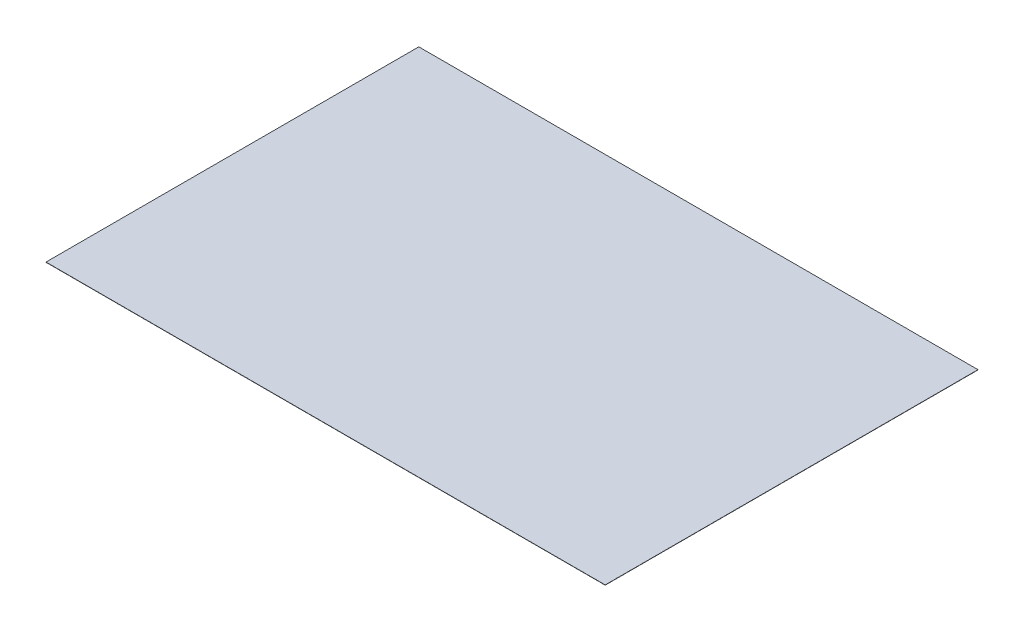
ISO-10303-21;
HEADER;
FILE_DESCRIPTION(('STEP AP214'),'2;1');
FILE_NAME('part.step','',(''),(''),'','','');
FILE_SCHEMA(('AUTOMOTIVE_DESIGN { 1 0 10303 214 1 1 1 1 }'));
ENDSEC;
DATA;
#1=APPLICATION_CONTEXT('core data for automotive mechanical design processes');
#2=APPLICATION_PROTOCOL_DEFINITION('international standard','automotive_design',2000,#1);
#3=PRODUCT_CONTEXT('',#1,'mechanical');
#4=PRODUCT('Part','Part','',(#3));
#5=PRODUCT_RELATED_PRODUCT_CATEGORY('part','',(#4));
#6=PRODUCT_DEFINITION_FORMATION('','',#4);
#7=PRODUCT_DEFINITION_CONTEXT('part definition',#1,'design');
#8=PRODUCT_DEFINITION('design','',#6,#7);
#9=PRODUCT_DEFINITION_SHAPE('','',#8);
#10=(LENGTH_UNIT() NAMED_UNIT(*) SI_UNIT(.MILLI.,.METRE.));
#11=(NAMED_UNIT(*) PLANE_ANGLE_UNIT() SI_UNIT($,.RADIAN.));
#12=(NAMED_UNIT(*) SI_UNIT($,.STERADIAN.) SOLID_ANGLE_UNIT());
#13=UNCERTAINTY_MEASURE_WITH_UNIT(LENGTH_MEASURE(1.E-05),#10,'distance_accuracy_value','');
#14=(GEOMETRIC_REPRESENTATION_CONTEXT(3) GLOBAL_UNCERTAINTY_ASSIGNED_CONTEXT((#13)) GLOBAL_UNIT_ASSIGNED_CONTEXT((#10,
#11,#12)) REPRESENTATION_CONTEXT('',''));
#15=CARTESIAN_POINT('',(0.,0.,0.));
#16=DIRECTION('',(0.,0.,1.));
#17=DIRECTION('',(1.,0.,0.));
#18=AXIS2_PLACEMENT_3D('',#15,#16,#17);
#19=CARTESIAN_POINT('',(0.,10.,0.));
#20=DIRECTION('',(1.,0.,0.));
#21=DIRECTION('',(0.,0.,-1.));
#22=AXIS2_PLACEMENT_3D('',#19,#20,#21);
#23=PLANE('',#22);
#24=DIRECTION('',(0.,0.,1.));
#25=VECTOR('',#24,1.);
#26=CARTESIAN_POINT('',(0.,0.,0.));
#27=LINE('',#26,#25);
#28=CARTESIAN_POINT('',(0.,0.,-16000.));
#29=VERTEX_POINT('',#28);
#30=CARTESIAN_POINT('',(0.,0.,0.));
#31=VERTEX_POINT('',#30);
#32=EDGE_CURVE('E97',#29,#31,#27,.T.);
#33=ORIENTED_EDGE('',*,*,#32,.T.);
#34=DIRECTION('',(0.,-1.,0.));
#35=VECTOR('',#34,1.);
#36=CARTESIAN_POINT('',(0.,10.,0.));
#37=LINE('',#36,#35);
#38=CARTESIAN_POINT('',(0.,10.,0.));
#39=VERTEX_POINT('',#38);
#40=EDGE_CURVE('E11',#39,#31,#37,.T.);
#41=ORIENTED_EDGE('',*,*,#40,.F.);
#42=DIRECTION('',(0.,0.,1.));
#43=VECTOR('',#42,1.);
#44=CARTESIAN_POINT('',(0.,10.,0.));
#45=LINE('',#44,#43);
#46=CARTESIAN_POINT('',(0.,10.,-16000.));
#47=VERTEX_POINT('',#46);
#48=EDGE_CURVE('E85',#47,#39,#45,.T.);
#49=ORIENTED_EDGE('',*,*,#48,.F.);
#50=DIRECTION('',(0.,-1.,0.));
#51=VECTOR('',#50,1.);
#52=CARTESIAN_POINT('',(0.,10.,-16000.));
#53=LINE('',#52,#51);
#54=EDGE_CURVE('E93',#47,#29,#53,.T.);
#55=ORIENTED_EDGE('',*,*,#54,.T.);
#56=EDGE_LOOP('',(#33,#41,#49,#55));
#57=FACE_BOUND('',#56,.T.);
#58=ADVANCED_FACE('F34',(#57),#23,.F.);
#59=CARTESIAN_POINT('',(0.,10.,0.));
#60=DIRECTION('',(0.,0.,-1.));
#61=DIRECTION('',(-1.,0.,0.));
#62=AXIS2_PLACEMENT_3D('',#59,#60,#61);
#63=PLANE('',#62);
#64=DIRECTION('',(1.,0.,0.));
#65=VECTOR('',#64,1.);
#66=CARTESIAN_POINT('',(0.,0.,0.));
#67=LINE('',#66,#65);
#68=CARTESIAN_POINT('',(24000.,0.,0.));
#69=VERTEX_POINT('',#68);
#70=EDGE_CURVE('E89',#31,#69,#67,.T.);
#71=ORIENTED_EDGE('',*,*,#70,.T.);
#72=DIRECTION('',(0.,-1.,0.));
#73=VECTOR('',#72,1.);
#74=CARTESIAN_POINT('',(24000.,10.,0.));
#75=LINE('',#74,#73);
#76=CARTESIAN_POINT('',(24000.,10.,0.));
#77=VERTEX_POINT('',#76);
#78=EDGE_CURVE('E42',#77,#69,#75,.T.);
#79=ORIENTED_EDGE('',*,*,#78,.F.);
#80=DIRECTION('',(1.,0.,0.));
#81=VECTOR('',#80,1.);
#82=CARTESIAN_POINT('',(0.,10.,0.));
#83=LINE('',#82,#81);
#84=EDGE_CURVE('E80',#39,#77,#83,.T.);
#85=ORIENTED_EDGE('',*,*,#84,.F.);
#86=ORIENTED_EDGE('',*,*,#40,.T.);
#87=EDGE_LOOP('',(#71,#79,#85,#86));
#88=FACE_BOUND('',#87,.T.);
#89=ADVANCED_FACE('F88',(#88),#63,.F.);
#90=CARTESIAN_POINT('',(24000.,10.,0.));
#91=DIRECTION('',(-1.,0.,0.));
#92=DIRECTION('',(0.,0.,1.));
#93=AXIS2_PLACEMENT_3D('',#90,#91,#92);
#94=PLANE('',#93);
#95=DIRECTION('',(0.,0.,-1.));
#96=VECTOR('',#95,1.);
#97=CARTESIAN_POINT('',(24000.,0.,0.));
#98=LINE('',#97,#96);
#99=CARTESIAN_POINT('',(24000.,0.,-16000.));
#100=VERTEX_POINT('',#99);
#101=EDGE_CURVE('E67',#69,#100,#98,.T.);
#102=ORIENTED_EDGE('',*,*,#101,.T.);
#103=DIRECTION('',(0.,-1.,0.));
#104=VECTOR('',#103,1.);
#105=CARTESIAN_POINT('',(24000.,10.,-16000.));
#106=LINE('',#105,#104);
#107=CARTESIAN_POINT('',(24000.,10.,-16000.));
#108=VERTEX_POINT('',#107);
#109=EDGE_CURVE('E90',#108,#100,#106,.T.);
#110=ORIENTED_EDGE('',*,*,#109,.F.);
#111=DIRECTION('',(0.,0.,-1.));
#112=VECTOR('',#111,1.);
#113=CARTESIAN_POINT('',(24000.,10.,0.));
#114=LINE('',#113,#112);
#115=EDGE_CURVE('E83',#77,#108,#114,.T.);
#116=ORIENTED_EDGE('',*,*,#115,.F.);
#117=ORIENTED_EDGE('',*,*,#78,.T.);
#118=EDGE_LOOP('',(#102,#110,#116,#117));
#119=FACE_BOUND('',#118,.T.);
#120=ADVANCED_FACE('F91',(#119),#94,.F.);
#121=CARTESIAN_POINT('',(0.,10.,-16000.));
#122=DIRECTION('',(0.,0.,1.));
#123=DIRECTION('',(1.,0.,0.));
#124=AXIS2_PLACEMENT_3D('',#121,#122,#123);
#125=PLANE('',#124);
#126=DIRECTION('',(-1.,0.,0.));
#127=VECTOR('',#126,1.);
#128=CARTESIAN_POINT('',(0.,0.,-16000.));
#129=LINE('',#128,#127);
#130=EDGE_CURVE('E73',#100,#29,#129,.T.);
#131=ORIENTED_EDGE('',*,*,#130,.T.);
#132=ORIENTED_EDGE('',*,*,#54,.F.);
#133=DIRECTION('',(-1.,0.,0.));
#134=VECTOR('',#133,1.);
#135=CARTESIAN_POINT('',(0.,10.,-16000.));
#136=LINE('',#135,#134);
#137=EDGE_CURVE('E50',#108,#47,#136,.T.);
#138=ORIENTED_EDGE('',*,*,#137,.F.);
#139=ORIENTED_EDGE('',*,*,#109,.T.);
#140=EDGE_LOOP('',(#131,#132,#138,#139));
#141=FACE_BOUND('',#140,.T.);
#142=ADVANCED_FACE('F104',(#141),#125,.F.);
#143=CARTESIAN_POINT('',(0.,10.,0.));
#144=DIRECTION('',(0.,-1.,0.));
#145=DIRECTION('',(0.,0.,-1.));
#146=AXIS2_PLACEMENT_3D('',#143,#144,#145);
#147=PLANE('',#146);
#148=ORIENTED_EDGE('',*,*,#48,.T.);
#149=ORIENTED_EDGE('',*,*,#84,.T.);
#150=ORIENTED_EDGE('',*,*,#115,.T.);
#151=ORIENTED_EDGE('',*,*,#137,.T.);
#152=EDGE_LOOP('',(#148,#149,#150,#151));
#153=FACE_BOUND('',#152,.T.);
#154=ADVANCED_FACE('F81',(#153),#147,.F.);
#155=CARTESIAN_POINT('',(0.,0.,0.));
#156=DIRECTION('',(0.,-1.,0.));
#157=DIRECTION('',(0.,0.,-1.));
#158=AXIS2_PLACEMENT_3D('',#155,#156,#157);
#159=PLANE('',#158);
#160=ORIENTED_EDGE('',*,*,#32,.F.);
#161=ORIENTED_EDGE('',*,*,#130,.F.);
#162=ORIENTED_EDGE('',*,*,#101,.F.);
#163=ORIENTED_EDGE('',*,*,#70,.F.);
#164=EDGE_LOOP('',(#160,#161,#162,#163));
#165=FACE_BOUND('',#164,.T.);
#166=ADVANCED_FACE('F107',(#165),#159,.T.);
#167=CLOSED_SHELL('',(#58,#89,#120,#142,#154,#166));
#168=MANIFOLD_SOLID_BREP('B2',#167);
#169=ADVANCED_BREP_SHAPE_REPRESENTATION('',(#18,#168),#14);
#170=SHAPE_DEFINITION_REPRESENTATION(#9,#169);
ENDSEC;
END-ISO-10303-21;
